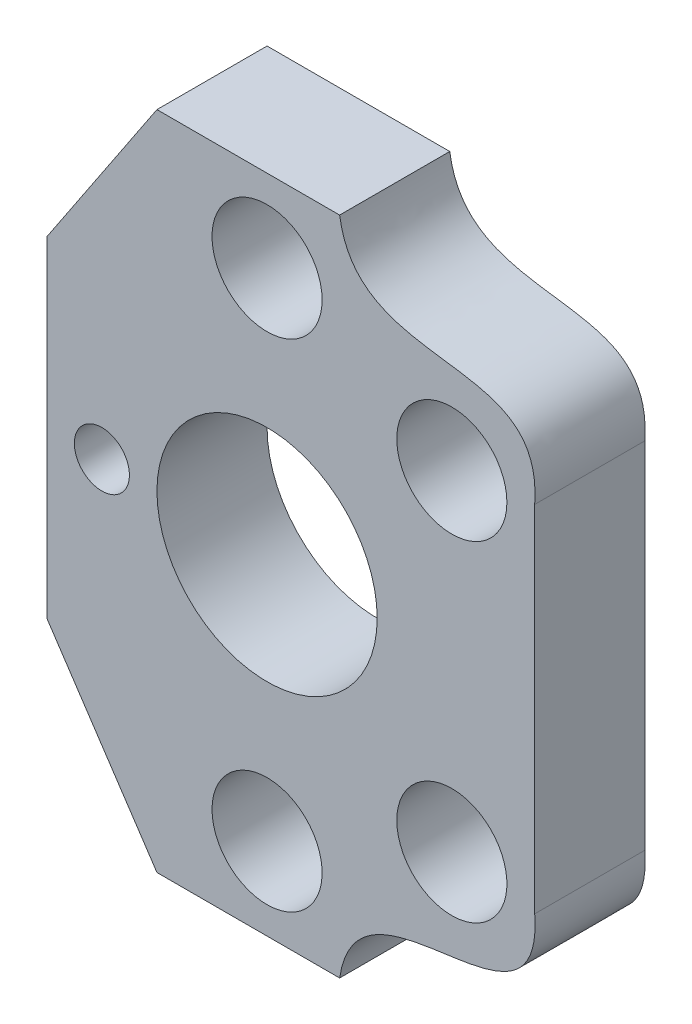
ISO-10303-21;
HEADER;
FILE_DESCRIPTION(('STEP AP214'),'2;1');
FILE_NAME('part.step','',(''),(''),'','','');
FILE_SCHEMA(('AUTOMOTIVE_DESIGN { 1 0 10303 214 1 1 1 1 }'));
ENDSEC;
DATA;
#1=APPLICATION_CONTEXT('core data for automotive mechanical design processes');
#2=APPLICATION_PROTOCOL_DEFINITION('international standard','automotive_design',2000,#1);
#3=PRODUCT_CONTEXT('',#1,'mechanical');
#4=PRODUCT('Part','Part','',(#3));
#5=PRODUCT_RELATED_PRODUCT_CATEGORY('part','',(#4));
#6=PRODUCT_DEFINITION_FORMATION('','',#4);
#7=PRODUCT_DEFINITION_CONTEXT('part definition',#1,'design');
#8=PRODUCT_DEFINITION('design','',#6,#7);
#9=PRODUCT_DEFINITION_SHAPE('','',#8);
#10=(LENGTH_UNIT() NAMED_UNIT(*) SI_UNIT(.MILLI.,.METRE.));
#11=(NAMED_UNIT(*) PLANE_ANGLE_UNIT() SI_UNIT($,.RADIAN.));
#12=(NAMED_UNIT(*) SI_UNIT($,.STERADIAN.) SOLID_ANGLE_UNIT());
#13=UNCERTAINTY_MEASURE_WITH_UNIT(LENGTH_MEASURE(1.E-05),#10,'distance_accuracy_value','');
#14=(GEOMETRIC_REPRESENTATION_CONTEXT(3) GLOBAL_UNCERTAINTY_ASSIGNED_CONTEXT((#13)) GLOBAL_UNIT_ASSIGNED_CONTEXT((#10,
#11,#12)) REPRESENTATION_CONTEXT('',''));
#15=CARTESIAN_POINT('',(0.,0.,0.));
#16=DIRECTION('',(0.,0.,1.));
#17=DIRECTION('',(1.,0.,0.));
#18=AXIS2_PLACEMENT_3D('',#15,#16,#17);
#19=CARTESIAN_POINT('',(16.4037399958371,15.8781755623704,10.));
#20=DIRECTION('',(0.,0.,-1.));
#21=DIRECTION('',(-1.,0.,0.));
#22=AXIS2_PLACEMENT_3D('',#19,#20,#21);
#23=PLANE('',#22);
#24=DIRECTION('',(-0.554700196225229,-0.832050294337844,0.));
#25=VECTOR('',#24,1.);
#26=CARTESIAN_POINT('',(-20.,7.59344754093431,10.));
#27=LINE('',#26,#25);
#28=CARTESIAN_POINT('',(-10.,22.5934475409343,10.));
#29=VERTEX_POINT('',#28);
#30=CARTESIAN_POINT('',(-20.,7.59344754093431,10.));
#31=VERTEX_POINT('',#30);
#32=EDGE_CURVE('E184',#29,#31,#27,.T.);
#33=ORIENTED_EDGE('',*,*,#32,.T.);
#34=DIRECTION('',(0.,-1.,0.));
#35=VECTOR('',#34,1.);
#36=CARTESIAN_POINT('',(-20.,-22.4065524590657,10.));
#37=LINE('',#36,#35);
#38=CARTESIAN_POINT('',(-20.,-22.4065524590657,10.));
#39=VERTEX_POINT('',#38);
#40=EDGE_CURVE('E104',#31,#39,#37,.T.);
#41=ORIENTED_EDGE('',*,*,#40,.T.);
#42=DIRECTION('',(0.554700196225229,-0.832050294337844,0.));
#43=VECTOR('',#42,1.);
#44=CARTESIAN_POINT('',(-20.,-22.4065524590657,10.));
#45=LINE('',#44,#43);
#46=CARTESIAN_POINT('',(-10.,-37.4065524590657,10.));
#47=VERTEX_POINT('',#46);
#48=EDGE_CURVE('E179',#39,#47,#45,.T.);
#49=ORIENTED_EDGE('',*,*,#48,.T.);
#50=DIRECTION('',(1.,0.,0.));
#51=VECTOR('',#50,1.);
#52=CARTESIAN_POINT('',(-10.,-37.4065524590657,10.));
#53=LINE('',#52,#51);
#54=CARTESIAN_POINT('',(6.58965389929385,-37.4065524590657,10.));
#55=VERTEX_POINT('',#54);
#56=EDGE_CURVE('E173',#47,#55,#53,.T.);
#57=ORIENTED_EDGE('',*,*,#56,.T.);
#58=CARTESIAN_POINT('',(6.58965389929385,-37.4065524590657,10.));
#59=CARTESIAN_POINT('',(8.27983063863976,-26.2487294054288,10.));
#60=CARTESIAN_POINT('',(25.1655466950219,-35.2907510605198,10.));
#61=CARTESIAN_POINT('',(24.3041340664176,-23.5052499871025,10.));
#62=B_SPLINE_CURVE_WITH_KNOTS('',3,(#58,#59,#60,#61),.UNSPECIFIED.,.F.,.F.,(4,4),(0.,1.),.UNSPECIFIED.);
#63=CARTESIAN_POINT('',(24.3041340664176,-23.5052499871025,10.));
#64=VERTEX_POINT('',#63);
#65=EDGE_CURVE('E124',#55,#64,#62,.T.);
#66=ORIENTED_EDGE('',*,*,#65,.T.);
#67=DIRECTION('',(0.,1.,0.));
#68=VECTOR('',#67,1.);
#69=CARTESIAN_POINT('',(24.3041340664176,8.69214506897108,10.));
#70=LINE('',#69,#68);
#71=CARTESIAN_POINT('',(24.3041340664176,8.69214506897108,10.));
#72=VERTEX_POINT('',#71);
#73=EDGE_CURVE('E117',#64,#72,#70,.T.);
#74=ORIENTED_EDGE('',*,*,#73,.T.);
#75=CARTESIAN_POINT('',(24.3041340664176,8.69214506897108,10.));
#76=CARTESIAN_POINT('',(25.1655466950219,20.4776461423884,10.));
#77=CARTESIAN_POINT('',(8.27983063863974,11.4356244872974,10.));
#78=CARTESIAN_POINT('',(6.58965389929385,22.5934475409343,10.));
#79=B_SPLINE_CURVE_WITH_KNOTS('',3,(#75,#76,#77,#78),.UNSPECIFIED.,.F.,.F.,(4,4),(0.,1.),.UNSPECIFIED.);
#80=CARTESIAN_POINT('',(6.58965389929385,22.5934475409343,10.));
#81=VERTEX_POINT('',#80);
#82=EDGE_CURVE('E121',#72,#81,#79,.T.);
#83=ORIENTED_EDGE('',*,*,#82,.T.);
#84=DIRECTION('',(-1.,0.,0.));
#85=VECTOR('',#84,1.);
#86=CARTESIAN_POINT('',(0.,22.5934475409343,10.));
#87=LINE('',#86,#85);
#88=EDGE_CURVE('E63',#81,#29,#87,.T.);
#89=ORIENTED_EDGE('',*,*,#88,.T.);
#90=EDGE_LOOP('',(#33,#41,#49,#57,#66,#74,#83,#89));
#91=FACE_BOUND('',#90,.T.);
#92=CARTESIAN_POINT('',(0.,15.1235564200078,10.));
#93=DIRECTION('',(0.,0.,1.));
#94=DIRECTION('',(1.,0.,0.));
#95=AXIS2_PLACEMENT_3D('',#92,#93,#94);
#96=CIRCLE('',#95,5.);
#97=CARTESIAN_POINT('',(5.,15.1235564200078,10.));
#98=VERTEX_POINT('',#97);
#99=EDGE_CURVE('E191',#98,#98,#96,.T.);
#100=ORIENTED_EDGE('',*,*,#99,.F.);
#101=EDGE_LOOP('',(#100));
#102=FACE_BOUND('',#101,.T.);
#103=CARTESIAN_POINT('',(16.7793991281704,7.59344754093431,10.));
#104=DIRECTION('',(0.,0.,1.));
#105=DIRECTION('',(1.,0.,0.));
#106=AXIS2_PLACEMENT_3D('',#103,#104,#105);
#107=CIRCLE('',#106,5.);
#108=CARTESIAN_POINT('',(21.7793991281704,7.59344754093431,10.));
#109=VERTEX_POINT('',#108);
#110=EDGE_CURVE('E192',#109,#109,#107,.T.);
#111=ORIENTED_EDGE('',*,*,#110,.F.);
#112=EDGE_LOOP('',(#111));
#113=FACE_BOUND('',#112,.T.);
#114=CARTESIAN_POINT('',(0.,-29.9366613381392,10.));
#115=DIRECTION('',(0.,0.,1.));
#116=DIRECTION('',(-1.,0.,0.));
#117=AXIS2_PLACEMENT_3D('',#114,#115,#116);
#118=CIRCLE('',#117,5.);
#119=CARTESIAN_POINT('',(-5.,-29.9366613381392,10.));
#120=VERTEX_POINT('',#119);
#121=EDGE_CURVE('E201',#120,#120,#118,.T.);
#122=ORIENTED_EDGE('',*,*,#121,.F.);
#123=EDGE_LOOP('',(#122));
#124=FACE_BOUND('',#123,.T.);
#125=CARTESIAN_POINT('',(-15.,-7.40655245906569,10.));
#126=DIRECTION('',(0.,0.,1.));
#127=DIRECTION('',(1.,0.,0.));
#128=AXIS2_PLACEMENT_3D('',#125,#126,#127);
#129=CIRCLE('',#128,2.5);
#130=CARTESIAN_POINT('',(-12.5,-7.40655245906569,10.));
#131=VERTEX_POINT('',#130);
#132=EDGE_CURVE('E209',#131,#131,#129,.T.);
#133=ORIENTED_EDGE('',*,*,#132,.F.);
#134=EDGE_LOOP('',(#133));
#135=FACE_BOUND('',#134,.T.);
#136=CARTESIAN_POINT('',(16.7793991281704,-22.4065524590657,10.));
#137=DIRECTION('',(0.,0.,1.));
#138=DIRECTION('',(-1.,0.,0.));
#139=AXIS2_PLACEMENT_3D('',#136,#137,#138);
#140=CIRCLE('',#139,5.);
#141=CARTESIAN_POINT('',(11.7793991281704,-22.4065524590657,10.));
#142=VERTEX_POINT('',#141);
#143=EDGE_CURVE('E217',#142,#142,#140,.T.);
#144=ORIENTED_EDGE('',*,*,#143,.F.);
#145=EDGE_LOOP('',(#144));
#146=FACE_BOUND('',#145,.T.);
#147=CARTESIAN_POINT('',(0.,-7.40655245906569,10.));
#148=DIRECTION('',(0.,0.,1.));
#149=DIRECTION('',(-1.,0.,0.));
#150=AXIS2_PLACEMENT_3D('',#147,#148,#149);
#151=CIRCLE('',#150,9.99999999999545);
#152=CARTESIAN_POINT('',(-9.99999999999545,-7.40655245906569,10.));
#153=VERTEX_POINT('',#152);
#154=EDGE_CURVE('E225',#153,#153,#151,.T.);
#155=ORIENTED_EDGE('',*,*,#154,.F.);
#156=EDGE_LOOP('',(#155));
#157=FACE_BOUND('',#156,.T.);
#158=ADVANCED_FACE('F45',(#91,#102,#113,#124,#135,#146,#157),#23,.F.);
#159=CARTESIAN_POINT('',(16.4037399958371,15.8781755623704,0.));
#160=DIRECTION('',(0.,0.,-1.));
#161=DIRECTION('',(-1.,0.,0.));
#162=AXIS2_PLACEMENT_3D('',#159,#160,#161);
#163=PLANE('',#162);
#164=CARTESIAN_POINT('',(16.7793991281704,-22.4065524590657,0.));
#165=DIRECTION('',(0.,0.,1.));
#166=DIRECTION('',(-1.,0.,0.));
#167=AXIS2_PLACEMENT_3D('',#164,#165,#166);
#168=CIRCLE('',#167,5.);
#169=CARTESIAN_POINT('',(11.7793991281704,-22.4065524590657,0.));
#170=VERTEX_POINT('',#169);
#171=EDGE_CURVE('E221',#170,#170,#168,.T.);
#172=ORIENTED_EDGE('',*,*,#171,.T.);
#173=EDGE_LOOP('',(#172));
#174=FACE_BOUND('',#173,.T.);
#175=CARTESIAN_POINT('',(0.,-29.9366613381392,0.));
#176=DIRECTION('',(0.,0.,1.));
#177=DIRECTION('',(-1.,0.,0.));
#178=AXIS2_PLACEMENT_3D('',#175,#176,#177);
#179=CIRCLE('',#178,5.);
#180=CARTESIAN_POINT('',(-5.,-29.9366613381392,0.));
#181=VERTEX_POINT('',#180);
#182=EDGE_CURVE('E205',#181,#181,#179,.T.);
#183=ORIENTED_EDGE('',*,*,#182,.T.);
#184=EDGE_LOOP('',(#183));
#185=FACE_BOUND('',#184,.T.);
#186=CARTESIAN_POINT('',(0.,15.1235564200078,0.));
#187=DIRECTION('',(0.,0.,1.));
#188=DIRECTION('',(1.,0.,0.));
#189=AXIS2_PLACEMENT_3D('',#186,#187,#188);
#190=CIRCLE('',#189,5.);
#191=CARTESIAN_POINT('',(5.,15.1235564200078,0.));
#192=VERTEX_POINT('',#191);
#193=EDGE_CURVE('E187',#192,#192,#190,.T.);
#194=ORIENTED_EDGE('',*,*,#193,.T.);
#195=EDGE_LOOP('',(#194));
#196=FACE_BOUND('',#195,.T.);
#197=DIRECTION('',(-0.554700196225229,-0.832050294337844,0.));
#198=VECTOR('',#197,1.);
#199=CARTESIAN_POINT('',(-20.,7.59344754093431,0.));
#200=LINE('',#199,#198);
#201=CARTESIAN_POINT('',(-10.,22.5934475409343,0.));
#202=VERTEX_POINT('',#201);
#203=CARTESIAN_POINT('',(-20.,7.59344754093431,0.));
#204=VERTEX_POINT('',#203);
#205=EDGE_CURVE('E196',#202,#204,#200,.T.);
#206=ORIENTED_EDGE('',*,*,#205,.F.);
#207=DIRECTION('',(-1.,0.,0.));
#208=VECTOR('',#207,1.);
#209=CARTESIAN_POINT('',(-10.,22.5934475409343,0.));
#210=LINE('',#209,#208);
#211=CARTESIAN_POINT('',(6.58965389929385,22.5934475409343,0.));
#212=VERTEX_POINT('',#211);
#213=EDGE_CURVE('E92',#212,#202,#210,.T.);
#214=ORIENTED_EDGE('',*,*,#213,.F.);
#215=CARTESIAN_POINT('',(24.3041340664176,8.69214506897108,0.));
#216=CARTESIAN_POINT('',(25.1655466950219,20.4776461423884,0.));
#217=CARTESIAN_POINT('',(8.27983063863974,11.4356244872974,0.));
#218=CARTESIAN_POINT('',(6.58965389929385,22.5934475409343,0.));
#219=B_SPLINE_CURVE_WITH_KNOTS('',3,(#215,#216,#217,#218),.UNSPECIFIED.,.F.,.F.,(4,4),(0.,1.),.UNSPECIFIED.);
#220=CARTESIAN_POINT('',(24.3041340664176,8.69214506897108,0.));
#221=VERTEX_POINT('',#220);
#222=EDGE_CURVE('E452',#221,#212,#219,.T.);
#223=ORIENTED_EDGE('',*,*,#222,.F.);
#224=DIRECTION('',(0.,1.,0.));
#225=VECTOR('',#224,1.);
#226=CARTESIAN_POINT('',(24.3041340664176,8.69214506897108,0.));
#227=LINE('',#226,#225);
#228=CARTESIAN_POINT('',(24.3041340664176,-23.5052499871025,0.));
#229=VERTEX_POINT('',#228);
#230=EDGE_CURVE('E134',#229,#221,#227,.T.);
#231=ORIENTED_EDGE('',*,*,#230,.F.);
#232=CARTESIAN_POINT('',(6.58965389929385,-37.4065524590657,0.));
#233=CARTESIAN_POINT('',(8.27983063863976,-26.2487294054288,0.));
#234=CARTESIAN_POINT('',(25.1655466950219,-35.2907510605198,0.));
#235=CARTESIAN_POINT('',(24.3041340664176,-23.5052499871025,0.));
#236=B_SPLINE_CURVE_WITH_KNOTS('',3,(#232,#233,#234,#235),.UNSPECIFIED.,.F.,.F.,(4,4),(0.,1.),.UNSPECIFIED.);
#237=CARTESIAN_POINT('',(6.58965389929385,-37.4065524590657,0.));
#238=VERTEX_POINT('',#237);
#239=EDGE_CURVE('E442',#238,#229,#236,.T.);
#240=ORIENTED_EDGE('',*,*,#239,.F.);
#241=DIRECTION('',(1.,0.,0.));
#242=VECTOR('',#241,1.);
#243=CARTESIAN_POINT('',(0.,-37.4065524590657,0.));
#244=LINE('',#243,#242);
#245=CARTESIAN_POINT('',(-10.,-37.4065524590657,0.));
#246=VERTEX_POINT('',#245);
#247=EDGE_CURVE('E439',#246,#238,#244,.T.);
#248=ORIENTED_EDGE('',*,*,#247,.F.);
#249=DIRECTION('',(0.554700196225229,-0.832050294337844,0.));
#250=VECTOR('',#249,1.);
#251=CARTESIAN_POINT('',(-20.,-22.4065524590657,0.));
#252=LINE('',#251,#250);
#253=CARTESIAN_POINT('',(-20.,-22.4065524590657,0.));
#254=VERTEX_POINT('',#253);
#255=EDGE_CURVE('E433',#254,#246,#252,.T.);
#256=ORIENTED_EDGE('',*,*,#255,.F.);
#257=DIRECTION('',(0.,-1.,0.));
#258=VECTOR('',#257,1.);
#259=CARTESIAN_POINT('',(-20.,-22.4065524590657,0.));
#260=LINE('',#259,#258);
#261=EDGE_CURVE('E431',#204,#254,#260,.T.);
#262=ORIENTED_EDGE('',*,*,#261,.F.);
#263=EDGE_LOOP('',(#206,#214,#223,#231,#240,#248,#256,#262));
#264=FACE_BOUND('',#263,.T.);
#265=CARTESIAN_POINT('',(16.7793991281704,7.59344754093431,0.));
#266=DIRECTION('',(0.,0.,1.));
#267=DIRECTION('',(1.,0.,0.));
#268=AXIS2_PLACEMENT_3D('',#265,#266,#267);
#269=CIRCLE('',#268,5.);
#270=CARTESIAN_POINT('',(21.7793991281704,7.59344754093431,0.));
#271=VERTEX_POINT('',#270);
#272=EDGE_CURVE('E197',#271,#271,#269,.T.);
#273=ORIENTED_EDGE('',*,*,#272,.T.);
#274=EDGE_LOOP('',(#273));
#275=FACE_BOUND('',#274,.T.);
#276=CARTESIAN_POINT('',(-15.,-7.40655245906569,0.));
#277=DIRECTION('',(0.,0.,1.));
#278=DIRECTION('',(1.,0.,0.));
#279=AXIS2_PLACEMENT_3D('',#276,#277,#278);
#280=CIRCLE('',#279,2.5);
#281=CARTESIAN_POINT('',(-12.5,-7.40655245906569,0.));
#282=VERTEX_POINT('',#281);
#283=EDGE_CURVE('E213',#282,#282,#280,.T.);
#284=ORIENTED_EDGE('',*,*,#283,.T.);
#285=EDGE_LOOP('',(#284));
#286=FACE_BOUND('',#285,.T.);
#287=CARTESIAN_POINT('',(0.,-7.40655245906569,0.));
#288=DIRECTION('',(0.,0.,1.));
#289=DIRECTION('',(-1.,0.,0.));
#290=AXIS2_PLACEMENT_3D('',#287,#288,#289);
#291=CIRCLE('',#290,9.99999999999545);
#292=CARTESIAN_POINT('',(-9.99999999999545,-7.40655245906569,0.));
#293=VERTEX_POINT('',#292);
#294=EDGE_CURVE('E229',#293,#293,#291,.T.);
#295=ORIENTED_EDGE('',*,*,#294,.T.);
#296=EDGE_LOOP('',(#295));
#297=FACE_BOUND('',#296,.T.);
#298=ADVANCED_FACE('F241',(#174,#185,#196,#264,#275,#286,#297),#163,.T.);
#299=CARTESIAN_POINT('',(-20.,7.59344754093431,10.));
#300=DIRECTION('',(0.832050294337844,-0.554700196225229,0.));
#301=DIRECTION('',(0.554700196225229,0.832050294337844,0.));
#302=AXIS2_PLACEMENT_3D('',#299,#300,#301);
#303=PLANE('',#302);
#304=ORIENTED_EDGE('',*,*,#205,.T.);
#305=DIRECTION('',(0.,0.,-1.));
#306=VECTOR('',#305,1.);
#307=CARTESIAN_POINT('',(-20.,7.59344754093431,10.));
#308=LINE('',#307,#306);
#309=EDGE_CURVE('E11',#31,#204,#308,.T.);
#310=ORIENTED_EDGE('',*,*,#309,.F.);
#311=ORIENTED_EDGE('',*,*,#32,.F.);
#312=DIRECTION('',(0.,0.,-1.));
#313=VECTOR('',#312,1.);
#314=CARTESIAN_POINT('',(-10.,22.5934475409343,10.));
#315=LINE('',#314,#313);
#316=EDGE_CURVE('E144',#29,#202,#315,.T.);
#317=ORIENTED_EDGE('',*,*,#316,.T.);
#318=EDGE_LOOP('',(#304,#310,#311,#317));
#319=FACE_BOUND('',#318,.T.);
#320=ADVANCED_FACE('F47',(#319),#303,.F.);
#321=CARTESIAN_POINT('',(-20.,-22.4065524590657,10.));
#322=DIRECTION('',(1.,0.,0.));
#323=DIRECTION('',(0.,0.,-1.));
#324=AXIS2_PLACEMENT_3D('',#321,#322,#323);
#325=PLANE('',#324);
#326=ORIENTED_EDGE('',*,*,#261,.T.);
#327=DIRECTION('',(0.,0.,-1.));
#328=VECTOR('',#327,1.);
#329=CARTESIAN_POINT('',(-20.,-22.4065524590657,10.));
#330=LINE('',#329,#328);
#331=EDGE_CURVE('E55',#39,#254,#330,.T.);
#332=ORIENTED_EDGE('',*,*,#331,.F.);
#333=ORIENTED_EDGE('',*,*,#40,.F.);
#334=ORIENTED_EDGE('',*,*,#309,.T.);
#335=EDGE_LOOP('',(#326,#332,#333,#334));
#336=FACE_BOUND('',#335,.T.);
#337=ADVANCED_FACE('F310',(#336),#325,.F.);
#338=CARTESIAN_POINT('',(-20.,-22.4065524590657,10.));
#339=DIRECTION('',(0.832050294337844,0.554700196225229,0.));
#340=DIRECTION('',(-0.554700196225229,0.832050294337844,0.));
#341=AXIS2_PLACEMENT_3D('',#338,#339,#340);
#342=PLANE('',#341);
#343=ORIENTED_EDGE('',*,*,#255,.T.);
#344=DIRECTION('',(0.,0.,-1.));
#345=VECTOR('',#344,1.);
#346=CARTESIAN_POINT('',(-10.,-37.4065524590657,10.));
#347=LINE('',#346,#345);
#348=EDGE_CURVE('E472',#47,#246,#347,.T.);
#349=ORIENTED_EDGE('',*,*,#348,.F.);
#350=ORIENTED_EDGE('',*,*,#48,.F.);
#351=ORIENTED_EDGE('',*,*,#331,.T.);
#352=EDGE_LOOP('',(#343,#349,#350,#351));
#353=FACE_BOUND('',#352,.T.);
#354=ADVANCED_FACE('F304',(#353),#342,.F.);
#355=CARTESIAN_POINT('',(0.,-37.4065524590657,10.));
#356=DIRECTION('',(0.,1.,0.));
#357=DIRECTION('',(0.,0.,1.));
#358=AXIS2_PLACEMENT_3D('',#355,#356,#357);
#359=PLANE('',#358);
#360=ORIENTED_EDGE('',*,*,#247,.T.);
#361=DIRECTION('',(0.,0.,-1.));
#362=VECTOR('',#361,1.);
#363=CARTESIAN_POINT('',(6.58965389929385,-37.4065524590657,10.));
#364=LINE('',#363,#362);
#365=EDGE_CURVE('E468',#55,#238,#364,.T.);
#366=ORIENTED_EDGE('',*,*,#365,.F.);
#367=ORIENTED_EDGE('',*,*,#56,.F.);
#368=ORIENTED_EDGE('',*,*,#348,.T.);
#369=EDGE_LOOP('',(#360,#366,#367,#368));
#370=FACE_BOUND('',#369,.T.);
#371=ADVANCED_FACE('F165',(#370),#359,.F.);
#372=DIRECTION('',(0.,0.,-1.));
#373=VECTOR('',#372,1.);
#374=SURFACE_OF_LINEAR_EXTRUSION('',#62,#373);
#375=ORIENTED_EDGE('',*,*,#239,.T.);
#376=DIRECTION('',(0.,0.,-1.));
#377=VECTOR('',#376,1.);
#378=CARTESIAN_POINT('',(24.3041340664176,-23.5052499871025,10.));
#379=LINE('',#378,#377);
#380=EDGE_CURVE('E137',#64,#229,#379,.T.);
#381=ORIENTED_EDGE('',*,*,#380,.F.);
#382=ORIENTED_EDGE('',*,*,#65,.F.);
#383=ORIENTED_EDGE('',*,*,#365,.T.);
#384=EDGE_LOOP('',(#375,#381,#382,#383));
#385=FACE_BOUND('',#384,.T.);
#386=ADVANCED_FACE('F162',(#385),#374,.F.);
#387=CARTESIAN_POINT('',(24.3041340664176,8.69214506897108,10.));
#388=DIRECTION('',(-1.,0.,0.));
#389=DIRECTION('',(0.,0.,1.));
#390=AXIS2_PLACEMENT_3D('',#387,#388,#389);
#391=PLANE('',#390);
#392=ORIENTED_EDGE('',*,*,#230,.T.);
#393=DIRECTION('',(0.,0.,-1.));
#394=VECTOR('',#393,1.);
#395=CARTESIAN_POINT('',(24.3041340664176,8.69214506897108,10.));
#396=LINE('',#395,#394);
#397=EDGE_CURVE('E131',#72,#221,#396,.T.);
#398=ORIENTED_EDGE('',*,*,#397,.F.);
#399=ORIENTED_EDGE('',*,*,#73,.F.);
#400=ORIENTED_EDGE('',*,*,#380,.T.);
#401=EDGE_LOOP('',(#392,#398,#399,#400));
#402=FACE_BOUND('',#401,.T.);
#403=ADVANCED_FACE('F132',(#402),#391,.F.);
#404=DIRECTION('',(0.,0.,-1.));
#405=VECTOR('',#404,1.);
#406=SURFACE_OF_LINEAR_EXTRUSION('',#79,#405);
#407=ORIENTED_EDGE('',*,*,#222,.T.);
#408=DIRECTION('',(0.,0.,-1.));
#409=VECTOR('',#408,1.);
#410=CARTESIAN_POINT('',(6.58965389929385,22.5934475409343,10.));
#411=LINE('',#410,#409);
#412=EDGE_CURVE('E138',#81,#212,#411,.T.);
#413=ORIENTED_EDGE('',*,*,#412,.F.);
#414=ORIENTED_EDGE('',*,*,#82,.F.);
#415=ORIENTED_EDGE('',*,*,#397,.T.);
#416=EDGE_LOOP('',(#407,#413,#414,#415));
#417=FACE_BOUND('',#416,.T.);
#418=ADVANCED_FACE('F140',(#417),#406,.F.);
#419=CARTESIAN_POINT('',(-10.,22.5934475409343,10.));
#420=DIRECTION('',(0.,-1.,0.));
#421=DIRECTION('',(0.,0.,-1.));
#422=AXIS2_PLACEMENT_3D('',#419,#420,#421);
#423=PLANE('',#422);
#424=ORIENTED_EDGE('',*,*,#213,.T.);
#425=ORIENTED_EDGE('',*,*,#316,.F.);
#426=ORIENTED_EDGE('',*,*,#88,.F.);
#427=ORIENTED_EDGE('',*,*,#412,.T.);
#428=EDGE_LOOP('',(#424,#425,#426,#427));
#429=FACE_BOUND('',#428,.T.);
#430=ADVANCED_FACE('F158',(#429),#423,.F.);
#431=CARTESIAN_POINT('',(0.,15.1235564200078,10.));
#432=DIRECTION('',(0.,0.,-1.));
#433=DIRECTION('',(-1.,0.,0.));
#434=AXIS2_PLACEMENT_3D('',#431,#432,#433);
#435=CYLINDRICAL_SURFACE('',#434,5.);
#436=ORIENTED_EDGE('',*,*,#99,.T.);
#437=EDGE_LOOP('',(#436));
#438=FACE_BOUND('',#437,.T.);
#439=ORIENTED_EDGE('',*,*,#193,.F.);
#440=EDGE_LOOP('',(#439));
#441=FACE_BOUND('',#440,.T.);
#442=ADVANCED_FACE('F248',(#438,#441),#435,.F.);
#443=CARTESIAN_POINT('',(16.7793991281704,7.59344754093431,10.));
#444=DIRECTION('',(0.,0.,-1.));
#445=DIRECTION('',(-1.,0.,0.));
#446=AXIS2_PLACEMENT_3D('',#443,#444,#445);
#447=CYLINDRICAL_SURFACE('',#446,5.);
#448=ORIENTED_EDGE('',*,*,#110,.T.);
#449=EDGE_LOOP('',(#448));
#450=FACE_BOUND('',#449,.T.);
#451=ORIENTED_EDGE('',*,*,#272,.F.);
#452=EDGE_LOOP('',(#451));
#453=FACE_BOUND('',#452,.T.);
#454=ADVANCED_FACE('F251',(#450,#453),#447,.F.);
#455=CARTESIAN_POINT('',(0.,-29.9366613381392,10.));
#456=DIRECTION('',(0.,0.,-1.));
#457=DIRECTION('',(-1.,0.,0.));
#458=AXIS2_PLACEMENT_3D('',#455,#456,#457);
#459=CYLINDRICAL_SURFACE('',#458,5.);
#460=ORIENTED_EDGE('',*,*,#121,.T.);
#461=EDGE_LOOP('',(#460));
#462=FACE_BOUND('',#461,.T.);
#463=ORIENTED_EDGE('',*,*,#182,.F.);
#464=EDGE_LOOP('',(#463));
#465=FACE_BOUND('',#464,.T.);
#466=ADVANCED_FACE('F255',(#462,#465),#459,.F.);
#467=CARTESIAN_POINT('',(-15.,-7.40655245906569,10.));
#468=DIRECTION('',(0.,0.,-1.));
#469=DIRECTION('',(-1.,0.,0.));
#470=AXIS2_PLACEMENT_3D('',#467,#468,#469);
#471=CYLINDRICAL_SURFACE('',#470,2.5);
#472=ORIENTED_EDGE('',*,*,#132,.T.);
#473=EDGE_LOOP('',(#472));
#474=FACE_BOUND('',#473,.T.);
#475=ORIENTED_EDGE('',*,*,#283,.F.);
#476=EDGE_LOOP('',(#475));
#477=FACE_BOUND('',#476,.T.);
#478=ADVANCED_FACE('F259',(#474,#477),#471,.F.);
#479=CARTESIAN_POINT('',(16.7793991281704,-22.4065524590657,10.));
#480=DIRECTION('',(0.,0.,-1.));
#481=DIRECTION('',(-1.,0.,0.));
#482=AXIS2_PLACEMENT_3D('',#479,#480,#481);
#483=CYLINDRICAL_SURFACE('',#482,5.);
#484=ORIENTED_EDGE('',*,*,#143,.T.);
#485=EDGE_LOOP('',(#484));
#486=FACE_BOUND('',#485,.T.);
#487=ORIENTED_EDGE('',*,*,#171,.F.);
#488=EDGE_LOOP('',(#487));
#489=FACE_BOUND('',#488,.T.);
#490=ADVANCED_FACE('F263',(#486,#489),#483,.F.);
#491=CARTESIAN_POINT('',(0.,-7.40655245906569,10.));
#492=DIRECTION('',(0.,0.,-1.));
#493=DIRECTION('',(-1.,0.,0.));
#494=AXIS2_PLACEMENT_3D('',#491,#492,#493);
#495=CYLINDRICAL_SURFACE('',#494,9.99999999999545);
#496=ORIENTED_EDGE('',*,*,#154,.T.);
#497=EDGE_LOOP('',(#496));
#498=FACE_BOUND('',#497,.T.);
#499=ORIENTED_EDGE('',*,*,#294,.F.);
#500=EDGE_LOOP('',(#499));
#501=FACE_BOUND('',#500,.T.);
#502=ADVANCED_FACE('F237',(#498,#501),#495,.F.);
#503=CLOSED_SHELL('',(#158,#298,#320,#337,#354,#371,#386,#403,#418,#430,#442,#454,#466,#478,
#490,#502));
#504=MANIFOLD_SOLID_BREP('B2',#503);
#505=ADVANCED_BREP_SHAPE_REPRESENTATION('',(#18,#504),#14);
#506=SHAPE_DEFINITION_REPRESENTATION(#9,#505);
ENDSEC;
END-ISO-10303-21;
